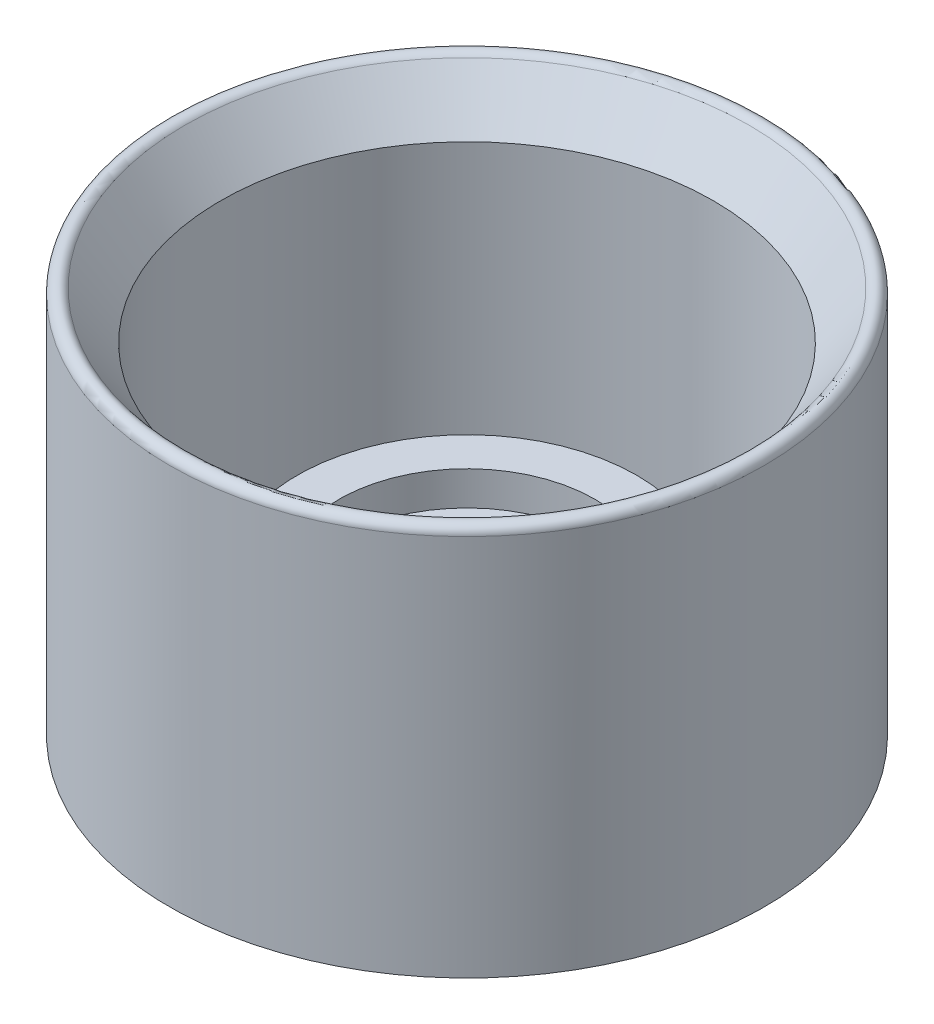
ISO-10303-21;
HEADER;
FILE_DESCRIPTION(('STEP AP214'),'2;1');
FILE_NAME('part.step','',(''),(''),'','','');
FILE_SCHEMA(('AUTOMOTIVE_DESIGN { 1 0 10303 214 1 1 1 1 }'));
ENDSEC;
DATA;
#1=APPLICATION_CONTEXT('core data for automotive mechanical design processes');
#2=APPLICATION_PROTOCOL_DEFINITION('international standard','automotive_design',2000,#1);
#3=PRODUCT_CONTEXT('',#1,'mechanical');
#4=PRODUCT('Part','Part','',(#3));
#5=PRODUCT_RELATED_PRODUCT_CATEGORY('part','',(#4));
#6=PRODUCT_DEFINITION_FORMATION('','',#4);
#7=PRODUCT_DEFINITION_CONTEXT('part definition',#1,'design');
#8=PRODUCT_DEFINITION('design','',#6,#7);
#9=PRODUCT_DEFINITION_SHAPE('','',#8);
#10=(LENGTH_UNIT() NAMED_UNIT(*) SI_UNIT(.MILLI.,.METRE.));
#11=(NAMED_UNIT(*) PLANE_ANGLE_UNIT() SI_UNIT($,.RADIAN.));
#12=(NAMED_UNIT(*) SI_UNIT($,.STERADIAN.) SOLID_ANGLE_UNIT());
#13=UNCERTAINTY_MEASURE_WITH_UNIT(LENGTH_MEASURE(1.E-05),#10,'distance_accuracy_value','');
#14=(GEOMETRIC_REPRESENTATION_CONTEXT(3) GLOBAL_UNCERTAINTY_ASSIGNED_CONTEXT((#13)) GLOBAL_UNIT_ASSIGNED_CONTEXT((#10,
#11,#12)) REPRESENTATION_CONTEXT('',''));
#15=CARTESIAN_POINT('',(0.,0.,0.));
#16=DIRECTION('',(0.,0.,1.));
#17=DIRECTION('',(1.,0.,0.));
#18=AXIS2_PLACEMENT_3D('',#15,#16,#17);
#19=CARTESIAN_POINT('',(0.,0.,0.));
#20=DIRECTION('',(0.,-1.,0.));
#21=DIRECTION('',(0.,0.,-1.));
#22=AXIS2_PLACEMENT_3D('',#19,#20,#21);
#23=CYLINDRICAL_SURFACE('',#22,1.50000000000077);
#24=CARTESIAN_POINT('',(0.,0.,0.));
#25=DIRECTION('',(0.,-1.,0.));
#26=DIRECTION('',(0.,0.,-1.));
#27=AXIS2_PLACEMENT_3D('',#24,#25,#26);
#28=CIRCLE('',#27,1.50000000000154);
#29=CARTESIAN_POINT('',(0.,0.,-1.50000000000154));
#30=VERTEX_POINT('',#29);
#31=EDGE_CURVE('E44',#30,#30,#28,.T.);
#32=ORIENTED_EDGE('',*,*,#31,.T.);
#33=EDGE_LOOP('',(#32));
#34=FACE_BOUND('',#33,.T.);
#35=CARTESIAN_POINT('',(0.,6.25,0.));
#36=DIRECTION('',(0.,-1.,0.));
#37=DIRECTION('',(0.,0.,-1.));
#38=AXIS2_PLACEMENT_3D('',#35,#36,#37);
#39=CIRCLE('',#38,1.5);
#40=CARTESIAN_POINT('',(0.,6.25,-1.5));
#41=VERTEX_POINT('',#40);
#42=EDGE_CURVE('E77',#41,#41,#39,.T.);
#43=ORIENTED_EDGE('',*,*,#42,.F.);
#44=EDGE_LOOP('',(#43));
#45=FACE_BOUND('',#44,.T.);
#46=ADVANCED_FACE('F33',(#34,#45),#23,.F.);
#47=CARTESIAN_POINT('',(0.,0.,-1.50000000000154));
#48=DIRECTION('',(0.,-1.,0.));
#49=DIRECTION('',(0.,0.,-1.));
#50=AXIS2_PLACEMENT_3D('',#47,#48,#49);
#51=PLANE('',#50);
#52=CARTESIAN_POINT('',(0.,0.,0.));
#53=DIRECTION('',(0.,-1.,0.));
#54=DIRECTION('',(0.,0.,-1.));
#55=AXIS2_PLACEMENT_3D('',#52,#53,#54);
#56=CIRCLE('',#55,17.5);
#57=CARTESIAN_POINT('',(0.,0.,-17.5));
#58=VERTEX_POINT('',#57);
#59=EDGE_CURVE('E48',#58,#58,#56,.T.);
#60=ORIENTED_EDGE('',*,*,#59,.T.);
#61=EDGE_LOOP('',(#60));
#62=FACE_BOUND('',#61,.T.);
#63=ORIENTED_EDGE('',*,*,#31,.F.);
#64=EDGE_LOOP('',(#63));
#65=FACE_BOUND('',#64,.T.);
#66=ADVANCED_FACE('F85',(#62,#65),#51,.T.);
#67=CARTESIAN_POINT('',(0.,0.,0.));
#68=DIRECTION('',(0.,-1.,0.));
#69=DIRECTION('',(0.,0.,-1.));
#70=AXIS2_PLACEMENT_3D('',#67,#68,#69);
#71=CYLINDRICAL_SURFACE('',#70,17.5);
#72=CARTESIAN_POINT('',(0.,22.5,0.));
#73=DIRECTION('',(0.,1.,0.));
#74=DIRECTION('',(0.,0.,1.));
#75=AXIS2_PLACEMENT_3D('',#72,#73,#74);
#76=CIRCLE('',#75,17.5);
#77=CARTESIAN_POINT('',(0.,22.5,17.5));
#78=VERTEX_POINT('',#77);
#79=EDGE_CURVE('E40',#78,#78,#76,.F.);
#80=ORIENTED_EDGE('',*,*,#79,.T.);
#81=EDGE_LOOP('',(#80));
#82=FACE_BOUND('',#81,.T.);
#83=ORIENTED_EDGE('',*,*,#59,.F.);
#84=EDGE_LOOP('',(#83));
#85=FACE_BOUND('',#84,.T.);
#86=ADVANCED_FACE('F90',(#82,#85),#71,.T.);
#87=CARTESIAN_POINT('',(0.,24.,0.));
#88=DIRECTION('',(0.,1.,0.));
#89=DIRECTION('',(0.,0.,1.));
#90=AXIS2_PLACEMENT_3D('',#87,#88,#89);
#91=CONICAL_SURFACE('',#90,17.5,0.643501108793285);
#92=CARTESIAN_POINT('',(0.,22.8,0.));
#93=DIRECTION('',(0.,-1.,0.));
#94=DIRECTION('',(0.,0.,-1.));
#95=AXIS2_PLACEMENT_3D('',#92,#93,#94);
#96=CIRCLE('',#95,16.6);
#97=CARTESIAN_POINT('',(0.,22.8,-16.6));
#98=VERTEX_POINT('',#97);
#99=EDGE_CURVE('E10',#98,#98,#96,.F.);
#100=ORIENTED_EDGE('',*,*,#99,.T.);
#101=EDGE_LOOP('',(#100));
#102=FACE_BOUND('',#101,.T.);
#103=CARTESIAN_POINT('',(0.,20.,0.));
#104=DIRECTION('',(0.,-1.,0.));
#105=DIRECTION('',(0.,0.,-1.));
#106=AXIS2_PLACEMENT_3D('',#103,#104,#105);
#107=CIRCLE('',#106,14.5);
#108=CARTESIAN_POINT('',(0.,20.,-14.5));
#109=VERTEX_POINT('',#108);
#110=EDGE_CURVE('E53',#109,#109,#107,.T.);
#111=ORIENTED_EDGE('',*,*,#110,.T.);
#112=EDGE_LOOP('',(#111));
#113=FACE_BOUND('',#112,.T.);
#114=ADVANCED_FACE('F96',(#102,#113),#91,.F.);
#115=CARTESIAN_POINT('',(0.,0.,0.));
#116=DIRECTION('',(0.,-1.,0.));
#117=DIRECTION('',(0.,0.,-1.));
#118=AXIS2_PLACEMENT_3D('',#115,#116,#117);
#119=CYLINDRICAL_SURFACE('',#118,14.5);
#120=CARTESIAN_POINT('',(0.,1.5,0.));
#121=DIRECTION('',(0.,-1.,0.));
#122=DIRECTION('',(0.,0.,-1.));
#123=AXIS2_PLACEMENT_3D('',#120,#121,#122);
#124=CIRCLE('',#123,14.5);
#125=CARTESIAN_POINT('',(0.,1.5,-14.5));
#126=VERTEX_POINT('',#125);
#127=EDGE_CURVE('E56',#126,#126,#124,.T.);
#128=ORIENTED_EDGE('',*,*,#127,.T.);
#129=EDGE_LOOP('',(#128));
#130=FACE_BOUND('',#129,.T.);
#131=ORIENTED_EDGE('',*,*,#110,.F.);
#132=EDGE_LOOP('',(#131));
#133=FACE_BOUND('',#132,.T.);
#134=ADVANCED_FACE('F99',(#130,#133),#119,.F.);
#135=CARTESIAN_POINT('',(0.,1.5,-14.5));
#136=DIRECTION('',(0.,1.,0.));
#137=DIRECTION('',(0.,0.,1.));
#138=AXIS2_PLACEMENT_3D('',#135,#136,#137);
#139=PLANE('',#138);
#140=CARTESIAN_POINT('',(0.,1.5,0.));
#141=DIRECTION('',(0.,-1.,0.));
#142=DIRECTION('',(0.,0.,-1.));
#143=AXIS2_PLACEMENT_3D('',#140,#141,#142);
#144=CIRCLE('',#143,11.5);
#145=CARTESIAN_POINT('',(0.,1.5,-11.5));
#146=VERTEX_POINT('',#145);
#147=EDGE_CURVE('E59',#146,#146,#144,.T.);
#148=ORIENTED_EDGE('',*,*,#147,.T.);
#149=EDGE_LOOP('',(#148));
#150=FACE_BOUND('',#149,.T.);
#151=ORIENTED_EDGE('',*,*,#127,.F.);
#152=EDGE_LOOP('',(#151));
#153=FACE_BOUND('',#152,.T.);
#154=ADVANCED_FACE('F102',(#150,#153),#139,.T.);
#155=CARTESIAN_POINT('',(0.,0.,0.));
#156=DIRECTION('',(0.,-1.,0.));
#157=DIRECTION('',(0.,0.,-1.));
#158=AXIS2_PLACEMENT_3D('',#155,#156,#157);
#159=CYLINDRICAL_SURFACE('',#158,11.5);
#160=CARTESIAN_POINT('',(0.,3.25,0.));
#161=DIRECTION('',(0.,-1.,0.));
#162=DIRECTION('',(0.,0.,-1.));
#163=AXIS2_PLACEMENT_3D('',#160,#161,#162);
#164=CIRCLE('',#163,11.5);
#165=CARTESIAN_POINT('',(0.,3.25,-11.5));
#166=VERTEX_POINT('',#165);
#167=EDGE_CURVE('E62',#166,#166,#164,.T.);
#168=ORIENTED_EDGE('',*,*,#167,.T.);
#169=EDGE_LOOP('',(#168));
#170=FACE_BOUND('',#169,.T.);
#171=ORIENTED_EDGE('',*,*,#147,.F.);
#172=EDGE_LOOP('',(#171));
#173=FACE_BOUND('',#172,.T.);
#174=ADVANCED_FACE('F106',(#170,#173),#159,.T.);
#175=CARTESIAN_POINT('',(0.,3.25,-11.5));
#176=DIRECTION('',(0.,1.,0.));
#177=DIRECTION('',(0.,0.,1.));
#178=AXIS2_PLACEMENT_3D('',#175,#176,#177);
#179=PLANE('',#178);
#180=CARTESIAN_POINT('',(0.,3.25,0.));
#181=DIRECTION('',(0.,-1.,0.));
#182=DIRECTION('',(0.,0.,-1.));
#183=AXIS2_PLACEMENT_3D('',#180,#181,#182);
#184=CIRCLE('',#183,10.);
#185=CARTESIAN_POINT('',(0.,3.25,-10.));
#186=VERTEX_POINT('',#185);
#187=EDGE_CURVE('E65',#186,#186,#184,.T.);
#188=ORIENTED_EDGE('',*,*,#187,.T.);
#189=EDGE_LOOP('',(#188));
#190=FACE_BOUND('',#189,.T.);
#191=ORIENTED_EDGE('',*,*,#167,.F.);
#192=EDGE_LOOP('',(#191));
#193=FACE_BOUND('',#192,.T.);
#194=ADVANCED_FACE('F110',(#190,#193),#179,.T.);
#195=CARTESIAN_POINT('',(0.,0.,0.));
#196=DIRECTION('',(0.,-1.,0.));
#197=DIRECTION('',(0.,0.,-1.));
#198=AXIS2_PLACEMENT_3D('',#195,#196,#197);
#199=CYLINDRICAL_SURFACE('',#198,10.);
#200=CARTESIAN_POINT('',(0.,8.25,0.));
#201=DIRECTION('',(0.,-1.,0.));
#202=DIRECTION('',(0.,0.,-1.));
#203=AXIS2_PLACEMENT_3D('',#200,#201,#202);
#204=CIRCLE('',#203,10.);
#205=CARTESIAN_POINT('',(0.,8.25,-10.));
#206=VERTEX_POINT('',#205);
#207=EDGE_CURVE('E68',#206,#206,#204,.T.);
#208=ORIENTED_EDGE('',*,*,#207,.T.);
#209=EDGE_LOOP('',(#208));
#210=FACE_BOUND('',#209,.T.);
#211=ORIENTED_EDGE('',*,*,#187,.F.);
#212=EDGE_LOOP('',(#211));
#213=FACE_BOUND('',#212,.T.);
#214=ADVANCED_FACE('F114',(#210,#213),#199,.T.);
#215=CARTESIAN_POINT('',(0.,8.25,-10.));
#216=DIRECTION('',(0.,1.,0.));
#217=DIRECTION('',(0.,0.,1.));
#218=AXIS2_PLACEMENT_3D('',#215,#216,#217);
#219=PLANE('',#218);
#220=CARTESIAN_POINT('',(0.,8.25,0.));
#221=DIRECTION('',(0.,-1.,0.));
#222=DIRECTION('',(0.,0.,-1.));
#223=AXIS2_PLACEMENT_3D('',#220,#221,#222);
#224=CIRCLE('',#223,7.55);
#225=CARTESIAN_POINT('',(0.,8.25,-7.55));
#226=VERTEX_POINT('',#225);
#227=EDGE_CURVE('E71',#226,#226,#224,.T.);
#228=ORIENTED_EDGE('',*,*,#227,.T.);
#229=EDGE_LOOP('',(#228));
#230=FACE_BOUND('',#229,.T.);
#231=ORIENTED_EDGE('',*,*,#207,.F.);
#232=EDGE_LOOP('',(#231));
#233=FACE_BOUND('',#232,.T.);
#234=ADVANCED_FACE('F118',(#230,#233),#219,.T.);
#235=CARTESIAN_POINT('',(0.,0.,0.));
#236=DIRECTION('',(0.,-1.,0.));
#237=DIRECTION('',(0.,0.,-1.));
#238=AXIS2_PLACEMENT_3D('',#235,#236,#237);
#239=CYLINDRICAL_SURFACE('',#238,7.55);
#240=CARTESIAN_POINT('',(0.,6.25,0.));
#241=DIRECTION('',(0.,-1.,0.));
#242=DIRECTION('',(0.,0.,-1.));
#243=AXIS2_PLACEMENT_3D('',#240,#241,#242);
#244=CIRCLE('',#243,7.55);
#245=CARTESIAN_POINT('',(0.,6.25,-7.55));
#246=VERTEX_POINT('',#245);
#247=EDGE_CURVE('E74',#246,#246,#244,.T.);
#248=ORIENTED_EDGE('',*,*,#247,.T.);
#249=EDGE_LOOP('',(#248));
#250=FACE_BOUND('',#249,.T.);
#251=ORIENTED_EDGE('',*,*,#227,.F.);
#252=EDGE_LOOP('',(#251));
#253=FACE_BOUND('',#252,.T.);
#254=ADVANCED_FACE('F122',(#250,#253),#239,.F.);
#255=CARTESIAN_POINT('',(0.,6.25,-7.55));
#256=DIRECTION('',(0.,1.,0.));
#257=DIRECTION('',(0.,0.,1.));
#258=AXIS2_PLACEMENT_3D('',#255,#256,#257);
#259=PLANE('',#258);
#260=ORIENTED_EDGE('',*,*,#42,.T.);
#261=EDGE_LOOP('',(#260));
#262=FACE_BOUND('',#261,.T.);
#263=ORIENTED_EDGE('',*,*,#247,.F.);
#264=EDGE_LOOP('',(#263));
#265=FACE_BOUND('',#264,.T.);
#266=ADVANCED_FACE('F81',(#262,#265),#259,.T.);
#267=CARTESIAN_POINT('',(0.,22.5,0.));
#268=DIRECTION('',(0.,1.,0.));
#269=DIRECTION('',(0.,0.,1.));
#270=AXIS2_PLACEMENT_3D('',#267,#268,#269);
#271=TOROIDAL_SURFACE('',#270,17.,0.5);
#272=ORIENTED_EDGE('',*,*,#99,.F.);
#273=EDGE_LOOP('',(#272));
#274=FACE_BOUND('',#273,.T.);
#275=ORIENTED_EDGE('',*,*,#79,.F.);
#276=EDGE_LOOP('',(#275));
#277=FACE_BOUND('',#276,.T.);
#278=ADVANCED_FACE('F35',(#274,#277),#271,.T.);
#279=CLOSED_SHELL('',(#46,#66,#86,#114,#134,#154,#174,#194,#214,#234,#254,#266,#278));
#280=MANIFOLD_SOLID_BREP('B2',#279);
#281=ADVANCED_BREP_SHAPE_REPRESENTATION('',(#18,#280),#14);
#282=SHAPE_DEFINITION_REPRESENTATION(#9,#281);
ENDSEC;
END-ISO-10303-21;
